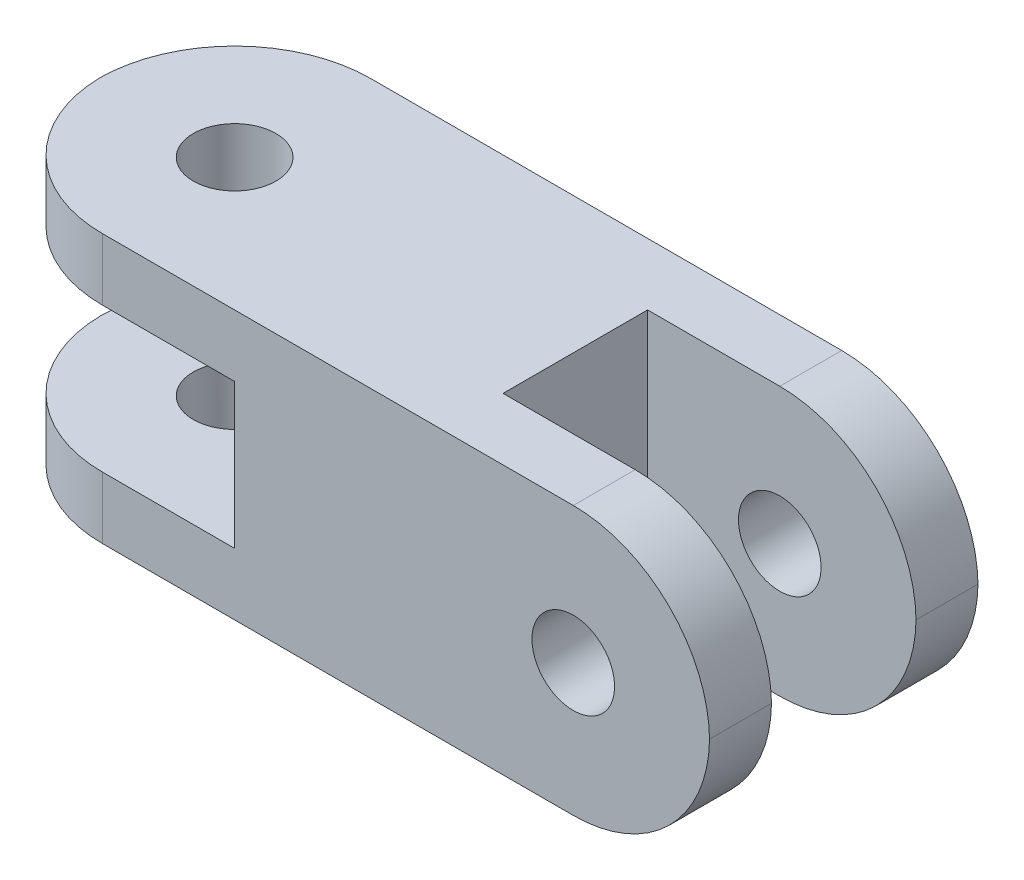
ISO-10303-21;
HEADER;
FILE_DESCRIPTION(('STEP AP214'),'2;1');
FILE_NAME('part.step','',(''),(''),'','','');
FILE_SCHEMA(('AUTOMOTIVE_DESIGN { 1 0 10303 214 1 1 1 1 }'));
ENDSEC;
DATA;
#1=APPLICATION_CONTEXT('core data for automotive mechanical design processes');
#2=APPLICATION_PROTOCOL_DEFINITION('international standard','automotive_design',2000,#1);
#3=PRODUCT_CONTEXT('',#1,'mechanical');
#4=PRODUCT('Part','Part','',(#3));
#5=PRODUCT_RELATED_PRODUCT_CATEGORY('part','',(#4));
#6=PRODUCT_DEFINITION_FORMATION('','',#4);
#7=PRODUCT_DEFINITION_CONTEXT('part definition',#1,'design');
#8=PRODUCT_DEFINITION('design','',#6,#7);
#9=PRODUCT_DEFINITION_SHAPE('','',#8);
#10=(LENGTH_UNIT() NAMED_UNIT(*) SI_UNIT(.MILLI.,.METRE.));
#11=(NAMED_UNIT(*) PLANE_ANGLE_UNIT() SI_UNIT($,.RADIAN.));
#12=(NAMED_UNIT(*) SI_UNIT($,.STERADIAN.) SOLID_ANGLE_UNIT());
#13=UNCERTAINTY_MEASURE_WITH_UNIT(LENGTH_MEASURE(1.E-05),#10,'distance_accuracy_value','');
#14=(GEOMETRIC_REPRESENTATION_CONTEXT(3) GLOBAL_UNCERTAINTY_ASSIGNED_CONTEXT((#13)) GLOBAL_UNIT_ASSIGNED_CONTEXT((#10,
#11,#12)) REPRESENTATION_CONTEXT('',''));
#15=CARTESIAN_POINT('',(0.,0.,0.));
#16=DIRECTION('',(0.,0.,1.));
#17=DIRECTION('',(1.,0.,0.));
#18=AXIS2_PLACEMENT_3D('',#15,#16,#17);
#19=CARTESIAN_POINT('',(57.,-0.500000000000007,32.5));
#20=DIRECTION('',(0.,0.,-1.));
#21=DIRECTION('',(-1.,0.,0.));
#22=AXIS2_PLACEMENT_3D('',#19,#20,#21);
#23=CYLINDRICAL_SURFACE('',#22,33.);
#24=CARTESIAN_POINT('',(57.,-0.500000000000007,17.5));
#25=DIRECTION('',(0.,0.,1.));
#26=DIRECTION('',(1.,0.,0.));
#27=AXIS2_PLACEMENT_3D('',#24,#25,#26);
#28=CIRCLE('',#27,33.);
#29=CARTESIAN_POINT('',(57.,32.5,17.5));
#30=VERTEX_POINT('',#29);
#31=CARTESIAN_POINT('',(89.9962119037928,8.27679938475434E-13,17.5));
#32=VERTEX_POINT('',#31);
#33=EDGE_CURVE('E201',#30,#32,#28,.F.);
#34=ORIENTED_EDGE('',*,*,#33,.F.);
#35=DIRECTION('',(0.,0.,-1.));
#36=VECTOR('',#35,1.);
#37=CARTESIAN_POINT('',(57.,32.5,32.5));
#38=LINE('',#37,#36);
#39=CARTESIAN_POINT('',(56.9999999999999,32.5,32.5));
#40=VERTEX_POINT('',#39);
#41=EDGE_CURVE('E304',#40,#30,#38,.T.);
#42=ORIENTED_EDGE('',*,*,#41,.F.);
#43=CARTESIAN_POINT('',(57.,-0.500000000000007,32.5));
#44=DIRECTION('',(0.,0.,1.));
#45=DIRECTION('',(1.,0.,0.));
#46=AXIS2_PLACEMENT_3D('',#43,#44,#45);
#47=CIRCLE('',#46,33.);
#48=CARTESIAN_POINT('',(89.9962119037928,2.2215302514228E-13,32.5));
#49=VERTEX_POINT('',#48);
#50=EDGE_CURVE('E297',#49,#40,#47,.T.);
#51=ORIENTED_EDGE('',*,*,#50,.F.);
#52=DIRECTION('',(0.,0.,-1.));
#53=VECTOR('',#52,1.);
#54=CARTESIAN_POINT('',(89.9962119037928,2.22044604925031E-13,0.));
#55=LINE('',#54,#53);
#56=EDGE_CURVE('E66',#32,#49,#55,.F.);
#57=ORIENTED_EDGE('',*,*,#56,.F.);
#58=EDGE_LOOP('',(#34,#42,#51,#57));
#59=FACE_BOUND('',#58,.T.);
#60=ADVANCED_FACE('F40',(#59),#23,.T.);
#61=CARTESIAN_POINT('',(57.,0.499999999999994,32.5));
#62=DIRECTION('',(0.,0.,-1.));
#63=DIRECTION('',(-1.,0.,0.));
#64=AXIS2_PLACEMENT_3D('',#61,#62,#63);
#65=CYLINDRICAL_SURFACE('',#64,33.);
#66=CARTESIAN_POINT('',(57.,0.499999999999994,17.5));
#67=DIRECTION('',(0.,0.,1.));
#68=DIRECTION('',(1.,0.,0.));
#69=AXIS2_PLACEMENT_3D('',#66,#67,#68);
#70=CIRCLE('',#69,33.);
#71=CARTESIAN_POINT('',(57.,-32.5,17.5));
#72=VERTEX_POINT('',#71);
#73=EDGE_CURVE('E11',#32,#72,#70,.F.);
#74=ORIENTED_EDGE('',*,*,#73,.F.);
#75=ORIENTED_EDGE('',*,*,#56,.T.);
#76=CARTESIAN_POINT('',(57.,0.499999999999994,32.5));
#77=DIRECTION('',(0.,0.,1.));
#78=DIRECTION('',(1.,0.,0.));
#79=AXIS2_PLACEMENT_3D('',#76,#77,#78);
#80=CIRCLE('',#79,33.);
#81=CARTESIAN_POINT('',(56.9999999999999,-32.5,32.5));
#82=VERTEX_POINT('',#81);
#83=EDGE_CURVE('E300',#82,#49,#80,.T.);
#84=ORIENTED_EDGE('',*,*,#83,.F.);
#85=DIRECTION('',(0.,0.,-1.));
#86=VECTOR('',#85,1.);
#87=CARTESIAN_POINT('',(57.,-32.5,32.5));
#88=LINE('',#87,#86);
#89=EDGE_CURVE('E294',#72,#82,#88,.F.);
#90=ORIENTED_EDGE('',*,*,#89,.F.);
#91=EDGE_LOOP('',(#74,#75,#84,#90));
#92=FACE_BOUND('',#91,.T.);
#93=ADVANCED_FACE('F364',(#92),#65,.T.);
#94=CARTESIAN_POINT('',(-57.,32.5,0.5));
#95=DIRECTION('',(0.,-1.,0.));
#96=DIRECTION('',(1.,0.,0.));
#97=AXIS2_PLACEMENT_3D('',#94,#95,#96);
#98=CYLINDRICAL_SURFACE('',#97,33.);
#99=CARTESIAN_POINT('',(-57.,17.5,0.5));
#100=DIRECTION('',(0.,1.,0.));
#101=DIRECTION('',(0.,0.,1.));
#102=AXIS2_PLACEMENT_3D('',#99,#100,#101);
#103=CIRCLE('',#102,33.);
#104=CARTESIAN_POINT('',(-89.9962119037928,17.5,-8.34618832379341E-13));
#105=VERTEX_POINT('',#104);
#106=CARTESIAN_POINT('',(-57.,17.5,-32.5));
#107=VERTEX_POINT('',#106);
#108=EDGE_CURVE('E237',#105,#107,#103,.F.);
#109=ORIENTED_EDGE('',*,*,#108,.F.);
#110=DIRECTION('',(0.,-1.,0.));
#111=VECTOR('',#110,1.);
#112=CARTESIAN_POINT('',(-89.9962119037928,0.,0.));
#113=LINE('',#112,#111);
#114=CARTESIAN_POINT('',(-89.9962119037928,32.5,0.));
#115=VERTEX_POINT('',#114);
#116=EDGE_CURVE('E253',#115,#105,#113,.T.);
#117=ORIENTED_EDGE('',*,*,#116,.F.);
#118=CARTESIAN_POINT('',(-57.,32.5,0.5));
#119=DIRECTION('',(0.,-1.,0.));
#120=DIRECTION('',(0.,0.,-1.));
#121=AXIS2_PLACEMENT_3D('',#118,#119,#120);
#122=CIRCLE('',#121,33.);
#123=CARTESIAN_POINT('',(-57.,32.5,-32.5));
#124=VERTEX_POINT('',#123);
#125=EDGE_CURVE('E267',#124,#115,#122,.F.);
#126=ORIENTED_EDGE('',*,*,#125,.F.);
#127=DIRECTION('',(0.,-1.,0.));
#128=VECTOR('',#127,1.);
#129=CARTESIAN_POINT('',(-57.,0.,-32.5));
#130=LINE('',#129,#128);
#131=EDGE_CURVE('E274',#107,#124,#130,.F.);
#132=ORIENTED_EDGE('',*,*,#131,.F.);
#133=EDGE_LOOP('',(#109,#117,#126,#132));
#134=FACE_BOUND('',#133,.T.);
#135=ADVANCED_FACE('F370',(#134),#98,.T.);
#136=CARTESIAN_POINT('',(-57.,0.,-0.5));
#137=DIRECTION('',(0.,1.,0.));
#138=DIRECTION('',(-1.,0.,0.));
#139=AXIS2_PLACEMENT_3D('',#136,#137,#138);
#140=CYLINDRICAL_SURFACE('',#139,33.);
#141=CARTESIAN_POINT('',(-57.,17.5,-0.5));
#142=DIRECTION('',(0.,1.,0.));
#143=DIRECTION('',(0.,0.,1.));
#144=AXIS2_PLACEMENT_3D('',#141,#142,#143);
#145=CIRCLE('',#144,33.);
#146=CARTESIAN_POINT('',(-57.,17.5,32.5));
#147=VERTEX_POINT('',#146);
#148=EDGE_CURVE('E285',#147,#105,#145,.F.);
#149=ORIENTED_EDGE('',*,*,#148,.F.);
#150=DIRECTION('',(0.,-1.,0.));
#151=VECTOR('',#150,1.);
#152=CARTESIAN_POINT('',(-57.,-32.5,32.5));
#153=LINE('',#152,#151);
#154=CARTESIAN_POINT('',(-57.,32.5,32.5));
#155=VERTEX_POINT('',#154);
#156=EDGE_CURVE('E256',#155,#147,#153,.T.);
#157=ORIENTED_EDGE('',*,*,#156,.F.);
#158=CARTESIAN_POINT('',(-57.,32.5,-0.5));
#159=DIRECTION('',(0.,-1.,0.));
#160=DIRECTION('',(0.,0.,-1.));
#161=AXIS2_PLACEMENT_3D('',#158,#159,#160);
#162=CIRCLE('',#161,33.);
#163=EDGE_CURVE('E270',#115,#155,#162,.F.);
#164=ORIENTED_EDGE('',*,*,#163,.F.);
#165=ORIENTED_EDGE('',*,*,#116,.T.);
#166=EDGE_LOOP('',(#149,#157,#164,#165));
#167=FACE_BOUND('',#166,.T.);
#168=ADVANCED_FACE('F427',(#167),#140,.T.);
#169=CARTESIAN_POINT('',(-90.,32.5,32.5));
#170=DIRECTION('',(0.,-1.,0.));
#171=DIRECTION('',(0.,0.,-1.));
#172=AXIS2_PLACEMENT_3D('',#169,#170,#171);
#173=PLANE('',#172);
#174=CARTESIAN_POINT('',(-57.,32.5,0.5));
#175=DIRECTION('',(0.,1.,0.));
#176=DIRECTION('',(0.,0.,1.));
#177=AXIS2_PLACEMENT_3D('',#174,#175,#176);
#178=CIRCLE('',#177,10.);
#179=CARTESIAN_POINT('',(-57.,32.5,10.5));
#180=VERTEX_POINT('',#179);
#181=EDGE_CURVE('E333',#180,#180,#178,.T.);
#182=ORIENTED_EDGE('',*,*,#181,.F.);
#183=EDGE_LOOP('',(#182));
#184=FACE_BOUND('',#183,.T.);
#185=ORIENTED_EDGE('',*,*,#41,.T.);
#186=DIRECTION('',(1.,0.,0.));
#187=VECTOR('',#186,1.);
#188=CARTESIAN_POINT('',(89.9962119037928,32.5,17.5));
#189=LINE('',#188,#187);
#190=CARTESIAN_POINT('',(24.9962119037928,32.5,17.5));
#191=VERTEX_POINT('',#190);
#192=EDGE_CURVE('E181',#191,#30,#189,.T.);
#193=ORIENTED_EDGE('',*,*,#192,.F.);
#194=DIRECTION('',(0.,0.,1.));
#195=VECTOR('',#194,1.);
#196=CARTESIAN_POINT('',(24.9962119037928,32.5,-17.5));
#197=LINE('',#196,#195);
#198=CARTESIAN_POINT('',(24.9962119037928,32.5,-17.5));
#199=VERTEX_POINT('',#198);
#200=EDGE_CURVE('E184',#199,#191,#197,.T.);
#201=ORIENTED_EDGE('',*,*,#200,.F.);
#202=DIRECTION('',(-1.,0.,0.));
#203=VECTOR('',#202,1.);
#204=CARTESIAN_POINT('',(89.9962119037928,32.5,-17.5));
#205=LINE('',#204,#203);
#206=CARTESIAN_POINT('',(57.,32.5,-17.5));
#207=VERTEX_POINT('',#206);
#208=EDGE_CURVE('E159',#207,#199,#205,.T.);
#209=ORIENTED_EDGE('',*,*,#208,.F.);
#210=CARTESIAN_POINT('',(56.9999999999999,32.5,-32.5));
#211=VERTEX_POINT('',#210);
#212=EDGE_CURVE('E303',#207,#211,#38,.T.);
#213=ORIENTED_EDGE('',*,*,#212,.T.);
#214=DIRECTION('',(-1.,0.,0.));
#215=VECTOR('',#214,1.);
#216=CARTESIAN_POINT('',(-90.,32.5,-32.5));
#217=LINE('',#216,#215);
#218=EDGE_CURVE('E250',#211,#124,#217,.T.);
#219=ORIENTED_EDGE('',*,*,#218,.T.);
#220=ORIENTED_EDGE('',*,*,#125,.T.);
#221=ORIENTED_EDGE('',*,*,#163,.T.);
#222=DIRECTION('',(-1.,0.,0.));
#223=VECTOR('',#222,1.);
#224=CARTESIAN_POINT('',(-90.,32.5,32.5));
#225=LINE('',#224,#223);
#226=EDGE_CURVE('E241',#40,#155,#225,.T.);
#227=ORIENTED_EDGE('',*,*,#226,.F.);
#228=EDGE_LOOP('',(#185,#193,#201,#209,#213,#219,#220,#221,#227));
#229=FACE_BOUND('',#228,.T.);
#230=ADVANCED_FACE('F431',(#184,#229),#173,.F.);
#231=CARTESIAN_POINT('',(-90.,-32.5,32.5));
#232=DIRECTION('',(0.,1.,0.));
#233=DIRECTION('',(0.,0.,1.));
#234=AXIS2_PLACEMENT_3D('',#231,#232,#233);
#235=PLANE('',#234);
#236=CARTESIAN_POINT('',(-57.,-32.5,0.5));
#237=DIRECTION('',(0.,1.,0.));
#238=DIRECTION('',(0.,0.,1.));
#239=AXIS2_PLACEMENT_3D('',#236,#237,#238);
#240=CIRCLE('',#239,10.);
#241=CARTESIAN_POINT('',(-57.,-32.5,10.5));
#242=VERTEX_POINT('',#241);
#243=EDGE_CURVE('E337',#242,#242,#240,.T.);
#244=ORIENTED_EDGE('',*,*,#243,.T.);
#245=EDGE_LOOP('',(#244));
#246=FACE_BOUND('',#245,.T.);
#247=DIRECTION('',(0.,0.,1.));
#248=VECTOR('',#247,1.);
#249=CARTESIAN_POINT('',(24.9962119037928,-32.5,-17.5));
#250=LINE('',#249,#248);
#251=CARTESIAN_POINT('',(24.9962119037928,-32.5,-17.5));
#252=VERTEX_POINT('',#251);
#253=CARTESIAN_POINT('',(24.9962119037928,-32.5,17.5));
#254=VERTEX_POINT('',#253);
#255=EDGE_CURVE('E168',#252,#254,#250,.T.);
#256=ORIENTED_EDGE('',*,*,#255,.T.);
#257=DIRECTION('',(1.,0.,0.));
#258=VECTOR('',#257,1.);
#259=CARTESIAN_POINT('',(89.9962119037928,-32.5,17.5));
#260=LINE('',#259,#258);
#261=EDGE_CURVE('E165',#254,#72,#260,.T.);
#262=ORIENTED_EDGE('',*,*,#261,.T.);
#263=ORIENTED_EDGE('',*,*,#89,.T.);
#264=DIRECTION('',(1.,0.,0.));
#265=VECTOR('',#264,1.);
#266=CARTESIAN_POINT('',(-90.,-32.5,32.5));
#267=LINE('',#266,#265);
#268=CARTESIAN_POINT('',(-57.,-32.5,32.5));
#269=VERTEX_POINT('',#268);
#270=EDGE_CURVE('E244',#269,#82,#267,.T.);
#271=ORIENTED_EDGE('',*,*,#270,.F.);
#272=CARTESIAN_POINT('',(-57.,-32.5,-0.5));
#273=DIRECTION('',(0.,1.,0.));
#274=DIRECTION('',(0.,0.,1.));
#275=AXIS2_PLACEMENT_3D('',#272,#273,#274);
#276=CIRCLE('',#275,33.);
#277=CARTESIAN_POINT('',(-89.9962119037928,-32.5,0.));
#278=VERTEX_POINT('',#277);
#279=EDGE_CURVE('E263',#269,#278,#276,.F.);
#280=ORIENTED_EDGE('',*,*,#279,.T.);
#281=CARTESIAN_POINT('',(-57.,-32.5,0.5));
#282=DIRECTION('',(0.,1.,0.));
#283=DIRECTION('',(0.,0.,1.));
#284=AXIS2_PLACEMENT_3D('',#281,#282,#283);
#285=CIRCLE('',#284,33.);
#286=CARTESIAN_POINT('',(-57.,-32.5,-32.5));
#287=VERTEX_POINT('',#286);
#288=EDGE_CURVE('E260',#278,#287,#285,.F.);
#289=ORIENTED_EDGE('',*,*,#288,.T.);
#290=DIRECTION('',(1.,0.,0.));
#291=VECTOR('',#290,1.);
#292=CARTESIAN_POINT('',(-90.,-32.5,-32.5));
#293=LINE('',#292,#291);
#294=CARTESIAN_POINT('',(56.9999999999999,-32.5,-32.5));
#295=VERTEX_POINT('',#294);
#296=EDGE_CURVE('E245',#287,#295,#293,.T.);
#297=ORIENTED_EDGE('',*,*,#296,.T.);
#298=CARTESIAN_POINT('',(57.,-32.5,-17.5));
#299=VERTEX_POINT('',#298);
#300=EDGE_CURVE('E179',#295,#299,#88,.F.);
#301=ORIENTED_EDGE('',*,*,#300,.T.);
#302=DIRECTION('',(-1.,0.,0.));
#303=VECTOR('',#302,1.);
#304=CARTESIAN_POINT('',(89.9962119037928,-32.5,-17.5));
#305=LINE('',#304,#303);
#306=EDGE_CURVE('E58',#299,#252,#305,.T.);
#307=ORIENTED_EDGE('',*,*,#306,.T.);
#308=EDGE_LOOP('',(#256,#262,#263,#271,#280,#289,#297,#301,#307));
#309=FACE_BOUND('',#308,.T.);
#310=ADVANCED_FACE('F176',(#246,#309),#235,.F.);
#311=CARTESIAN_POINT('',(0.,0.,32.5));
#312=DIRECTION('',(0.,0.,1.));
#313=DIRECTION('',(1.,0.,0.));
#314=AXIS2_PLACEMENT_3D('',#311,#312,#313);
#315=PLANE('',#314);
#316=CARTESIAN_POINT('',(57.,-0.500000000000007,32.5));
#317=DIRECTION('',(0.,0.,-1.));
#318=DIRECTION('',(-1.,0.,0.));
#319=AXIS2_PLACEMENT_3D('',#316,#317,#318);
#320=CIRCLE('',#319,10.);
#321=CARTESIAN_POINT('',(47.,-0.500000000000007,32.5));
#322=VERTEX_POINT('',#321);
#323=EDGE_CURVE('E315',#322,#322,#320,.T.);
#324=ORIENTED_EDGE('',*,*,#323,.T.);
#325=EDGE_LOOP('',(#324));
#326=FACE_BOUND('',#325,.T.);
#327=ORIENTED_EDGE('',*,*,#270,.T.);
#328=ORIENTED_EDGE('',*,*,#83,.T.);
#329=ORIENTED_EDGE('',*,*,#50,.T.);
#330=ORIENTED_EDGE('',*,*,#226,.T.);
#331=ORIENTED_EDGE('',*,*,#156,.T.);
#332=DIRECTION('',(-1.,0.,0.));
#333=VECTOR('',#332,1.);
#334=CARTESIAN_POINT('',(-89.9962119037928,17.5,32.5));
#335=LINE('',#334,#333);
#336=CARTESIAN_POINT('',(-24.9962119037928,17.5,32.5));
#337=VERTEX_POINT('',#336);
#338=EDGE_CURVE('E212',#337,#147,#335,.T.);
#339=ORIENTED_EDGE('',*,*,#338,.F.);
#340=DIRECTION('',(0.,1.,0.));
#341=VECTOR('',#340,1.);
#342=CARTESIAN_POINT('',(-24.9962119037928,17.5,32.5));
#343=LINE('',#342,#341);
#344=CARTESIAN_POINT('',(-24.9962119037928,-17.5,32.5));
#345=VERTEX_POINT('',#344);
#346=EDGE_CURVE('E207',#345,#337,#343,.T.);
#347=ORIENTED_EDGE('',*,*,#346,.F.);
#348=DIRECTION('',(1.,0.,0.));
#349=VECTOR('',#348,1.);
#350=CARTESIAN_POINT('',(-89.9962119037928,-17.5,32.5));
#351=LINE('',#350,#349);
#352=CARTESIAN_POINT('',(-57.,-17.5,32.5));
#353=VERTEX_POINT('',#352);
#354=EDGE_CURVE('E204',#353,#345,#351,.T.);
#355=ORIENTED_EDGE('',*,*,#354,.F.);
#356=EDGE_CURVE('E249',#353,#269,#153,.T.);
#357=ORIENTED_EDGE('',*,*,#356,.T.);
#358=EDGE_LOOP('',(#327,#328,#329,#330,#331,#339,#347,#355,#357));
#359=FACE_BOUND('',#358,.T.);
#360=ADVANCED_FACE('F423',(#326,#359),#315,.T.);
#361=CARTESIAN_POINT('',(0.,0.,-32.5));
#362=DIRECTION('',(0.,0.,1.));
#363=DIRECTION('',(1.,0.,0.));
#364=AXIS2_PLACEMENT_3D('',#361,#362,#363);
#365=PLANE('',#364);
#366=CARTESIAN_POINT('',(57.,-0.500000000000007,-32.5));
#367=DIRECTION('',(0.,0.,-1.));
#368=DIRECTION('',(-1.,0.,0.));
#369=AXIS2_PLACEMENT_3D('',#366,#367,#368);
#370=CIRCLE('',#369,10.);
#371=CARTESIAN_POINT('',(47.,-0.500000000000007,-32.5));
#372=VERTEX_POINT('',#371);
#373=EDGE_CURVE('E322',#372,#372,#370,.T.);
#374=ORIENTED_EDGE('',*,*,#373,.F.);
#375=EDGE_LOOP('',(#374));
#376=FACE_BOUND('',#375,.T.);
#377=CARTESIAN_POINT('',(57.,-0.500000000000007,-32.5));
#378=DIRECTION('',(0.,0.,1.));
#379=DIRECTION('',(1.,0.,0.));
#380=AXIS2_PLACEMENT_3D('',#377,#378,#379);
#381=CIRCLE('',#380,33.);
#382=CARTESIAN_POINT('',(89.9962119037928,2.2215302514228E-13,-32.5));
#383=VERTEX_POINT('',#382);
#384=EDGE_CURVE('E288',#211,#383,#381,.F.);
#385=ORIENTED_EDGE('',*,*,#384,.T.);
#386=CARTESIAN_POINT('',(57.,0.499999999999994,-32.5));
#387=DIRECTION('',(0.,0.,1.));
#388=DIRECTION('',(1.,0.,0.));
#389=AXIS2_PLACEMENT_3D('',#386,#387,#388);
#390=CIRCLE('',#389,33.);
#391=EDGE_CURVE('E291',#383,#295,#390,.F.);
#392=ORIENTED_EDGE('',*,*,#391,.T.);
#393=ORIENTED_EDGE('',*,*,#296,.F.);
#394=CARTESIAN_POINT('',(-57.,-17.5,-32.5));
#395=VERTEX_POINT('',#394);
#396=EDGE_CURVE('E275',#287,#395,#130,.F.);
#397=ORIENTED_EDGE('',*,*,#396,.T.);
#398=DIRECTION('',(1.,0.,0.));
#399=VECTOR('',#398,1.);
#400=CARTESIAN_POINT('',(-89.9962119037928,-17.5,-32.5));
#401=LINE('',#400,#399);
#402=CARTESIAN_POINT('',(-24.9962119037928,-17.5,-32.5));
#403=VERTEX_POINT('',#402);
#404=EDGE_CURVE('E215',#395,#403,#401,.T.);
#405=ORIENTED_EDGE('',*,*,#404,.T.);
#406=DIRECTION('',(0.,1.,0.));
#407=VECTOR('',#406,1.);
#408=CARTESIAN_POINT('',(-24.9962119037928,17.5,-32.5));
#409=LINE('',#408,#407);
#410=CARTESIAN_POINT('',(-24.9962119037928,17.5,-32.5));
#411=VERTEX_POINT('',#410);
#412=EDGE_CURVE('E219',#403,#411,#409,.T.);
#413=ORIENTED_EDGE('',*,*,#412,.T.);
#414=DIRECTION('',(-1.,0.,0.));
#415=VECTOR('',#414,1.);
#416=CARTESIAN_POINT('',(-89.9962119037928,17.5,-32.5));
#417=LINE('',#416,#415);
#418=EDGE_CURVE('E223',#411,#107,#417,.T.);
#419=ORIENTED_EDGE('',*,*,#418,.T.);
#420=ORIENTED_EDGE('',*,*,#131,.T.);
#421=ORIENTED_EDGE('',*,*,#218,.F.);
#422=EDGE_LOOP('',(#385,#392,#393,#397,#405,#413,#419,#420,#421));
#423=FACE_BOUND('',#422,.T.);
#424=ADVANCED_FACE('F390',(#376,#423),#365,.F.);
#425=CARTESIAN_POINT('',(-57.,-17.5,0.5));
#426=DIRECTION('',(0.,-1.,0.));
#427=DIRECTION('',(0.,0.,-1.));
#428=AXIS2_PLACEMENT_3D('',#425,#426,#427);
#429=CIRCLE('',#428,33.);
#430=CARTESIAN_POINT('',(-89.9962119037928,-17.5,0.));
#431=VERTEX_POINT('',#430);
#432=EDGE_CURVE('E231',#395,#431,#429,.F.);
#433=ORIENTED_EDGE('',*,*,#432,.F.);
#434=ORIENTED_EDGE('',*,*,#396,.F.);
#435=ORIENTED_EDGE('',*,*,#288,.F.);
#436=EDGE_CURVE('E240',#431,#278,#113,.T.);
#437=ORIENTED_EDGE('',*,*,#436,.F.);
#438=EDGE_LOOP('',(#433,#434,#435,#437));
#439=FACE_BOUND('',#438,.T.);
#440=ADVANCED_FACE('F399',(#439),#98,.T.);
#441=CARTESIAN_POINT('',(-57.,-17.5,-0.5));
#442=DIRECTION('',(0.,-1.,0.));
#443=DIRECTION('',(0.,0.,-1.));
#444=AXIS2_PLACEMENT_3D('',#441,#442,#443);
#445=CIRCLE('',#444,33.);
#446=EDGE_CURVE('E279',#431,#353,#445,.F.);
#447=ORIENTED_EDGE('',*,*,#446,.F.);
#448=ORIENTED_EDGE('',*,*,#436,.T.);
#449=ORIENTED_EDGE('',*,*,#279,.F.);
#450=ORIENTED_EDGE('',*,*,#356,.F.);
#451=EDGE_LOOP('',(#447,#448,#449,#450));
#452=FACE_BOUND('',#451,.T.);
#453=ADVANCED_FACE('F420',(#452),#140,.T.);
#454=CARTESIAN_POINT('',(-89.9962119037928,17.5,-32.5));
#455=DIRECTION('',(0.,1.,0.));
#456=DIRECTION('',(0.,0.,1.));
#457=AXIS2_PLACEMENT_3D('',#454,#455,#456);
#458=PLANE('',#457);
#459=CARTESIAN_POINT('',(-57.,17.5,0.5));
#460=DIRECTION('',(0.,1.,0.));
#461=DIRECTION('',(0.,0.,1.));
#462=AXIS2_PLACEMENT_3D('',#459,#460,#461);
#463=CIRCLE('',#462,10.);
#464=CARTESIAN_POINT('',(-57.,17.5,10.5));
#465=VERTEX_POINT('',#464);
#466=EDGE_CURVE('E328',#465,#465,#463,.T.);
#467=ORIENTED_EDGE('',*,*,#466,.T.);
#468=EDGE_LOOP('',(#467));
#469=FACE_BOUND('',#468,.T.);
#470=ORIENTED_EDGE('',*,*,#108,.T.);
#471=ORIENTED_EDGE('',*,*,#418,.F.);
#472=DIRECTION('',(0.,0.,1.));
#473=VECTOR('',#472,1.);
#474=CARTESIAN_POINT('',(-24.9962119037928,17.5,-32.5));
#475=LINE('',#474,#473);
#476=EDGE_CURVE('E228',#411,#337,#475,.T.);
#477=ORIENTED_EDGE('',*,*,#476,.T.);
#478=ORIENTED_EDGE('',*,*,#338,.T.);
#479=ORIENTED_EDGE('',*,*,#148,.T.);
#480=EDGE_LOOP('',(#470,#471,#477,#478,#479));
#481=FACE_BOUND('',#480,.T.);
#482=ADVANCED_FACE('F408',(#469,#481),#458,.F.);
#483=CARTESIAN_POINT('',(-24.9962119037928,17.5,-32.5));
#484=DIRECTION('',(1.,0.,0.));
#485=DIRECTION('',(0.,1.,0.));
#486=AXIS2_PLACEMENT_3D('',#483,#484,#485);
#487=PLANE('',#486);
#488=ORIENTED_EDGE('',*,*,#476,.F.);
#489=ORIENTED_EDGE('',*,*,#412,.F.);
#490=DIRECTION('',(0.,0.,1.));
#491=VECTOR('',#490,1.);
#492=CARTESIAN_POINT('',(-24.9962119037928,-17.5,-32.5));
#493=LINE('',#492,#491);
#494=EDGE_CURVE('E227',#403,#345,#493,.T.);
#495=ORIENTED_EDGE('',*,*,#494,.T.);
#496=ORIENTED_EDGE('',*,*,#346,.T.);
#497=EDGE_LOOP('',(#488,#489,#495,#496));
#498=FACE_BOUND('',#497,.T.);
#499=ADVANCED_FACE('F381',(#498),#487,.F.);
#500=CARTESIAN_POINT('',(-89.9962119037928,-17.5,-32.5));
#501=DIRECTION('',(0.,-1.,0.));
#502=DIRECTION('',(0.,0.,-1.));
#503=AXIS2_PLACEMENT_3D('',#500,#501,#502);
#504=PLANE('',#503);
#505=CARTESIAN_POINT('',(-57.,-17.5,0.5));
#506=DIRECTION('',(0.,-1.,0.));
#507=DIRECTION('',(0.,0.,-1.));
#508=AXIS2_PLACEMENT_3D('',#505,#506,#507);
#509=CIRCLE('',#508,10.);
#510=CARTESIAN_POINT('',(-57.,-17.5,-9.5));
#511=VERTEX_POINT('',#510);
#512=EDGE_CURVE('E44',#511,#511,#509,.T.);
#513=ORIENTED_EDGE('',*,*,#512,.T.);
#514=EDGE_LOOP('',(#513));
#515=FACE_BOUND('',#514,.T.);
#516=ORIENTED_EDGE('',*,*,#432,.T.);
#517=ORIENTED_EDGE('',*,*,#446,.T.);
#518=ORIENTED_EDGE('',*,*,#354,.T.);
#519=ORIENTED_EDGE('',*,*,#494,.F.);
#520=ORIENTED_EDGE('',*,*,#404,.F.);
#521=EDGE_LOOP('',(#516,#517,#518,#519,#520));
#522=FACE_BOUND('',#521,.T.);
#523=ADVANCED_FACE('F346',(#515,#522),#504,.F.);
#524=CARTESIAN_POINT('',(57.,-0.500000000000007,-17.5));
#525=DIRECTION('',(0.,0.,-1.));
#526=DIRECTION('',(-1.,0.,0.));
#527=AXIS2_PLACEMENT_3D('',#524,#525,#526);
#528=CIRCLE('',#527,33.);
#529=CARTESIAN_POINT('',(89.9962119037928,8.27679938475434E-13,-17.5));
#530=VERTEX_POINT('',#529);
#531=EDGE_CURVE('E197',#530,#207,#528,.F.);
#532=ORIENTED_EDGE('',*,*,#531,.F.);
#533=EDGE_CURVE('E208',#383,#530,#55,.F.);
#534=ORIENTED_EDGE('',*,*,#533,.F.);
#535=ORIENTED_EDGE('',*,*,#384,.F.);
#536=ORIENTED_EDGE('',*,*,#212,.F.);
#537=EDGE_LOOP('',(#532,#534,#535,#536));
#538=FACE_BOUND('',#537,.T.);
#539=ADVANCED_FACE('F42',(#538),#23,.T.);
#540=CARTESIAN_POINT('',(57.,0.499999999999994,-17.5));
#541=DIRECTION('',(0.,0.,-1.));
#542=DIRECTION('',(-1.,0.,0.));
#543=AXIS2_PLACEMENT_3D('',#540,#541,#542);
#544=CIRCLE('',#543,33.);
#545=EDGE_CURVE('E50',#299,#530,#544,.F.);
#546=ORIENTED_EDGE('',*,*,#545,.F.);
#547=ORIENTED_EDGE('',*,*,#300,.F.);
#548=ORIENTED_EDGE('',*,*,#391,.F.);
#549=ORIENTED_EDGE('',*,*,#533,.T.);
#550=EDGE_LOOP('',(#546,#547,#548,#549));
#551=FACE_BOUND('',#550,.T.);
#552=ADVANCED_FACE('F371',(#551),#65,.T.);
#553=CARTESIAN_POINT('',(89.9962119037928,-32.5,17.5));
#554=DIRECTION('',(0.,0.,1.));
#555=DIRECTION('',(1.,0.,0.));
#556=AXIS2_PLACEMENT_3D('',#553,#554,#555);
#557=PLANE('',#556);
#558=CARTESIAN_POINT('',(57.,-0.500000000000007,17.5));
#559=DIRECTION('',(0.,0.,1.));
#560=DIRECTION('',(1.,0.,0.));
#561=AXIS2_PLACEMENT_3D('',#558,#559,#560);
#562=CIRCLE('',#561,10.);
#563=CARTESIAN_POINT('',(67.,-0.500000000000007,17.5));
#564=VERTEX_POINT('',#563);
#565=EDGE_CURVE('E187',#564,#564,#562,.T.);
#566=ORIENTED_EDGE('',*,*,#565,.T.);
#567=EDGE_LOOP('',(#566));
#568=FACE_BOUND('',#567,.T.);
#569=ORIENTED_EDGE('',*,*,#33,.T.);
#570=ORIENTED_EDGE('',*,*,#73,.T.);
#571=ORIENTED_EDGE('',*,*,#261,.F.);
#572=DIRECTION('',(0.,1.,0.));
#573=VECTOR('',#572,1.);
#574=CARTESIAN_POINT('',(24.9962119037928,-32.5,17.5));
#575=LINE('',#574,#573);
#576=EDGE_CURVE('E164',#254,#191,#575,.T.);
#577=ORIENTED_EDGE('',*,*,#576,.T.);
#578=ORIENTED_EDGE('',*,*,#192,.T.);
#579=EDGE_LOOP('',(#569,#570,#571,#577,#578));
#580=FACE_BOUND('',#579,.T.);
#581=ADVANCED_FACE('F379',(#568,#580),#557,.F.);
#582=CARTESIAN_POINT('',(24.9962119037928,-32.5,-17.5));
#583=DIRECTION('',(-1.,0.,0.));
#584=DIRECTION('',(0.,0.,1.));
#585=AXIS2_PLACEMENT_3D('',#582,#583,#584);
#586=PLANE('',#585);
#587=ORIENTED_EDGE('',*,*,#200,.T.);
#588=ORIENTED_EDGE('',*,*,#576,.F.);
#589=ORIENTED_EDGE('',*,*,#255,.F.);
#590=DIRECTION('',(0.,1.,0.));
#591=VECTOR('',#590,1.);
#592=CARTESIAN_POINT('',(24.9962119037928,-32.5,-17.5));
#593=LINE('',#592,#591);
#594=EDGE_CURVE('E155',#252,#199,#593,.T.);
#595=ORIENTED_EDGE('',*,*,#594,.T.);
#596=EDGE_LOOP('',(#587,#588,#589,#595));
#597=FACE_BOUND('',#596,.T.);
#598=ADVANCED_FACE('F169',(#597),#586,.F.);
#599=CARTESIAN_POINT('',(89.9962119037928,-32.5,-17.5));
#600=DIRECTION('',(0.,0.,-1.));
#601=DIRECTION('',(-1.,0.,0.));
#602=AXIS2_PLACEMENT_3D('',#599,#600,#601);
#603=PLANE('',#602);
#604=CARTESIAN_POINT('',(57.,-0.500000000000007,-17.5));
#605=DIRECTION('',(0.,0.,-1.));
#606=DIRECTION('',(-1.,0.,0.));
#607=AXIS2_PLACEMENT_3D('',#604,#605,#606);
#608=CIRCLE('',#607,10.);
#609=CARTESIAN_POINT('',(47.,-0.500000000000007,-17.5));
#610=VERTEX_POINT('',#609);
#611=EDGE_CURVE('E312',#610,#610,#608,.T.);
#612=ORIENTED_EDGE('',*,*,#611,.T.);
#613=EDGE_LOOP('',(#612));
#614=FACE_BOUND('',#613,.T.);
#615=ORIENTED_EDGE('',*,*,#531,.T.);
#616=ORIENTED_EDGE('',*,*,#208,.T.);
#617=ORIENTED_EDGE('',*,*,#594,.F.);
#618=ORIENTED_EDGE('',*,*,#306,.F.);
#619=ORIENTED_EDGE('',*,*,#545,.T.);
#620=EDGE_LOOP('',(#615,#616,#617,#618,#619));
#621=FACE_BOUND('',#620,.T.);
#622=ADVANCED_FACE('F157',(#614,#621),#603,.F.);
#623=CARTESIAN_POINT('',(57.,-0.500000000000007,32.5));
#624=DIRECTION('',(0.,0.,-1.));
#625=DIRECTION('',(-1.,0.,0.));
#626=AXIS2_PLACEMENT_3D('',#623,#624,#625);
#627=CYLINDRICAL_SURFACE('',#626,10.);
#628=ORIENTED_EDGE('',*,*,#373,.T.);
#629=EDGE_LOOP('',(#628));
#630=FACE_BOUND('',#629,.T.);
#631=ORIENTED_EDGE('',*,*,#611,.F.);
#632=EDGE_LOOP('',(#631));
#633=FACE_BOUND('',#632,.T.);
#634=ADVANCED_FACE('F360',(#630,#633),#627,.F.);
#635=ORIENTED_EDGE('',*,*,#323,.F.);
#636=EDGE_LOOP('',(#635));
#637=FACE_BOUND('',#636,.T.);
#638=ORIENTED_EDGE('',*,*,#565,.F.);
#639=EDGE_LOOP('',(#638));
#640=FACE_BOUND('',#639,.T.);
#641=ADVANCED_FACE('F352',(#637,#640),#627,.F.);
#642=CARTESIAN_POINT('',(-57.,-32.5,0.5));
#643=DIRECTION('',(0.,1.,0.));
#644=DIRECTION('',(0.,0.,1.));
#645=AXIS2_PLACEMENT_3D('',#642,#643,#644);
#646=CYLINDRICAL_SURFACE('',#645,10.);
#647=ORIENTED_EDGE('',*,*,#243,.F.);
#648=EDGE_LOOP('',(#647));
#649=FACE_BOUND('',#648,.T.);
#650=ORIENTED_EDGE('',*,*,#512,.F.);
#651=EDGE_LOOP('',(#650));
#652=FACE_BOUND('',#651,.T.);
#653=ADVANCED_FACE('F349',(#649,#652),#646,.F.);
#654=ORIENTED_EDGE('',*,*,#181,.T.);
#655=EDGE_LOOP('',(#654));
#656=FACE_BOUND('',#655,.T.);
#657=ORIENTED_EDGE('',*,*,#466,.F.);
#658=EDGE_LOOP('',(#657));
#659=FACE_BOUND('',#658,.T.);
#660=ADVANCED_FACE('F351',(#656,#659),#646,.F.);
#661=CLOSED_SHELL('',(#60,#93,#135,#168,#230,#310,#360,#424,#440,#453,#482,#499,#523,#539,#552,
#581,#598,#622,#634,#641,#653,#660));
#662=MANIFOLD_SOLID_BREP('B2',#661);
#663=ADVANCED_BREP_SHAPE_REPRESENTATION('',(#18,#662),#14);
#664=SHAPE_DEFINITION_REPRESENTATION(#9,#663);
ENDSEC;
END-ISO-10303-21;
